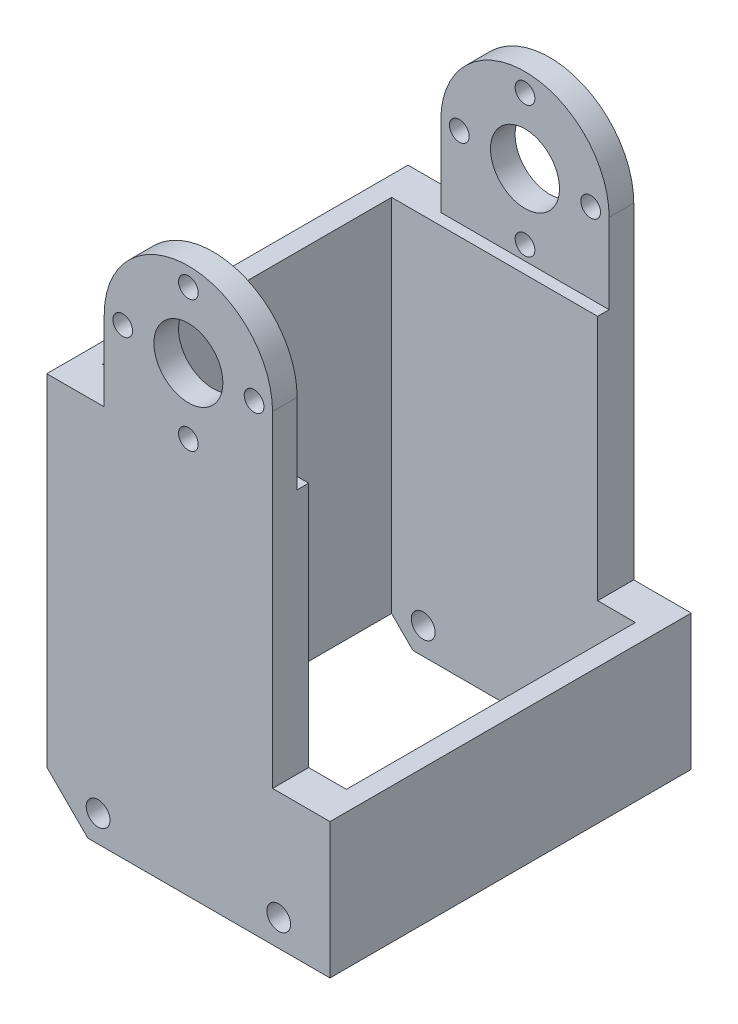
ISO-10303-21;
HEADER;
FILE_DESCRIPTION(('STEP AP214'),'2;1');
FILE_NAME('part.step','',(''),(''),'','','');
FILE_SCHEMA(('AUTOMOTIVE_DESIGN { 1 0 10303 214 1 1 1 1 }'));
ENDSEC;
DATA;
#1=APPLICATION_CONTEXT('core data for automotive mechanical design processes');
#2=APPLICATION_PROTOCOL_DEFINITION('international standard','automotive_design',2000,#1);
#3=PRODUCT_CONTEXT('',#1,'mechanical');
#4=PRODUCT('Part','Part','',(#3));
#5=PRODUCT_RELATED_PRODUCT_CATEGORY('part','',(#4));
#6=PRODUCT_DEFINITION_FORMATION('','',#4);
#7=PRODUCT_DEFINITION_CONTEXT('part definition',#1,'design');
#8=PRODUCT_DEFINITION('design','',#6,#7);
#9=PRODUCT_DEFINITION_SHAPE('','',#8);
#10=(LENGTH_UNIT() NAMED_UNIT(*) SI_UNIT(.MILLI.,.METRE.));
#11=(NAMED_UNIT(*) PLANE_ANGLE_UNIT() SI_UNIT($,.RADIAN.));
#12=(NAMED_UNIT(*) SI_UNIT($,.STERADIAN.) SOLID_ANGLE_UNIT());
#13=UNCERTAINTY_MEASURE_WITH_UNIT(LENGTH_MEASURE(1.E-05),#10,'distance_accuracy_value','');
#14=(GEOMETRIC_REPRESENTATION_CONTEXT(3) GLOBAL_UNCERTAINTY_ASSIGNED_CONTEXT((#13)) GLOBAL_UNIT_ASSIGNED_CONTEXT((#10,
#11,#12)) REPRESENTATION_CONTEXT('',''));
#15=CARTESIAN_POINT('',(0.,0.,0.));
#16=DIRECTION('',(0.,0.,1.));
#17=DIRECTION('',(1.,0.,0.));
#18=AXIS2_PLACEMENT_3D('',#15,#16,#17);
#19=CARTESIAN_POINT('',(0.,0.,-22.));
#20=DIRECTION('',(0.,0.,1.));
#21=DIRECTION('',(1.,0.,0.));
#22=AXIS2_PLACEMENT_3D('',#19,#20,#21);
#23=PLANE('',#22);
#24=CARTESIAN_POINT('',(-8.,0.,-22.));
#25=DIRECTION('',(0.,0.,1.));
#26=DIRECTION('',(1.,0.,0.));
#27=AXIS2_PLACEMENT_3D('',#24,#25,#26);
#28=CIRCLE('',#27,1.2);
#29=CARTESIAN_POINT('',(-6.8,0.,-22.));
#30=VERTEX_POINT('',#29);
#31=EDGE_CURVE('E406',#30,#30,#28,.T.);
#32=ORIENTED_EDGE('',*,*,#31,.T.);
#33=EDGE_LOOP('',(#32));
#34=FACE_BOUND('',#33,.T.);
#35=CARTESIAN_POINT('',(0.,8.,-22.));
#36=DIRECTION('',(0.,0.,1.));
#37=DIRECTION('',(1.,0.,0.));
#38=AXIS2_PLACEMENT_3D('',#35,#36,#37);
#39=CIRCLE('',#38,1.2);
#40=CARTESIAN_POINT('',(1.2,8.,-22.));
#41=VERTEX_POINT('',#40);
#42=EDGE_CURVE('E410',#41,#41,#39,.T.);
#43=ORIENTED_EDGE('',*,*,#42,.T.);
#44=EDGE_LOOP('',(#43));
#45=FACE_BOUND('',#44,.T.);
#46=CARTESIAN_POINT('',(8.,0.,-22.));
#47=DIRECTION('',(0.,0.,1.));
#48=DIRECTION('',(1.,0.,0.));
#49=AXIS2_PLACEMENT_3D('',#46,#47,#48);
#50=CIRCLE('',#49,1.2);
#51=CARTESIAN_POINT('',(9.2,0.,-22.));
#52=VERTEX_POINT('',#51);
#53=EDGE_CURVE('E414',#52,#52,#50,.T.);
#54=ORIENTED_EDGE('',*,*,#53,.T.);
#55=EDGE_LOOP('',(#54));
#56=FACE_BOUND('',#55,.T.);
#57=CARTESIAN_POINT('',(0.,0.,-22.));
#58=DIRECTION('',(0.,0.,1.));
#59=DIRECTION('',(1.,0.,0.));
#60=AXIS2_PLACEMENT_3D('',#57,#58,#59);
#61=CIRCLE('',#60,4.2);
#62=CARTESIAN_POINT('',(4.2,0.,-22.));
#63=VERTEX_POINT('',#62);
#64=EDGE_CURVE('E418',#63,#63,#61,.T.);
#65=ORIENTED_EDGE('',*,*,#64,.T.);
#66=EDGE_LOOP('',(#65));
#67=FACE_BOUND('',#66,.T.);
#68=CARTESIAN_POINT('',(0.,-8.,-22.));
#69=DIRECTION('',(0.,0.,1.));
#70=DIRECTION('',(1.,0.,0.));
#71=AXIS2_PLACEMENT_3D('',#68,#69,#70);
#72=CIRCLE('',#71,1.2);
#73=CARTESIAN_POINT('',(1.19999999999994,-8.,-22.));
#74=VERTEX_POINT('',#73);
#75=EDGE_CURVE('E433',#74,#74,#72,.T.);
#76=ORIENTED_EDGE('',*,*,#75,.T.);
#77=EDGE_LOOP('',(#76));
#78=FACE_BOUND('',#77,.T.);
#79=CARTESIAN_POINT('',(11.,-53.,-22.));
#80=DIRECTION('',(0.,0.,1.));
#81=DIRECTION('',(1.,0.,0.));
#82=AXIS2_PLACEMENT_3D('',#79,#80,#81);
#83=CIRCLE('',#82,1.45);
#84=CARTESIAN_POINT('',(12.45,-53.,-22.));
#85=VERTEX_POINT('',#84);
#86=EDGE_CURVE('E601',#85,#85,#83,.T.);
#87=ORIENTED_EDGE('',*,*,#86,.T.);
#88=EDGE_LOOP('',(#87));
#89=FACE_BOUND('',#88,.T.);
#90=CARTESIAN_POINT('',(-11.,-53.,-22.));
#91=DIRECTION('',(0.,0.,1.));
#92=DIRECTION('',(1.,0.,0.));
#93=AXIS2_PLACEMENT_3D('',#90,#91,#92);
#94=CIRCLE('',#93,1.45);
#95=CARTESIAN_POINT('',(-9.55,-53.,-22.));
#96=VERTEX_POINT('',#95);
#97=EDGE_CURVE('E592',#96,#96,#94,.T.);
#98=ORIENTED_EDGE('',*,*,#97,.T.);
#99=EDGE_LOOP('',(#98));
#100=FACE_BOUND('',#99,.T.);
#101=DIRECTION('',(1.,0.,0.));
#102=VECTOR('',#101,1.);
#103=CARTESIAN_POINT('',(0.,-56.25,-22.));
#104=LINE('',#103,#102);
#105=CARTESIAN_POINT('',(-12.25,-56.25,-22.));
#106=VERTEX_POINT('',#105);
#107=CARTESIAN_POINT('',(17.25,-56.25,-22.));
#108=VERTEX_POINT('',#107);
#109=EDGE_CURVE('E517',#106,#108,#104,.T.);
#110=ORIENTED_EDGE('',*,*,#109,.F.);
#111=DIRECTION('',(0.707106781186544,-0.707106781186551,0.));
#112=VECTOR('',#111,1.);
#113=CARTESIAN_POINT('',(-17.25,-51.2499999999999,-22.));
#114=LINE('',#113,#112);
#115=CARTESIAN_POINT('',(-17.25,-51.2499999999999,-22.));
#116=VERTEX_POINT('',#115);
#117=EDGE_CURVE('E12',#106,#116,#114,.F.);
#118=ORIENTED_EDGE('',*,*,#117,.T.);
#119=DIRECTION('',(0.,1.,0.));
#120=VECTOR('',#119,1.);
#121=CARTESIAN_POINT('',(-17.25,-75.25,-22.));
#122=LINE('',#121,#120);
#123=CARTESIAN_POINT('',(-17.25,-9.75,-22.));
#124=VERTEX_POINT('',#123);
#125=EDGE_CURVE('E306',#116,#124,#122,.T.);
#126=ORIENTED_EDGE('',*,*,#125,.T.);
#127=DIRECTION('',(-1.,0.,0.));
#128=VECTOR('',#127,1.);
#129=CARTESIAN_POINT('',(-10.25,-9.75,-22.));
#130=LINE('',#129,#128);
#131=CARTESIAN_POINT('',(-10.25,-9.75,-22.));
#132=VERTEX_POINT('',#131);
#133=EDGE_CURVE('E295',#132,#124,#130,.T.);
#134=ORIENTED_EDGE('',*,*,#133,.F.);
#135=DIRECTION('',(0.,-1.,0.));
#136=VECTOR('',#135,1.);
#137=CARTESIAN_POINT('',(-10.25,0.,-22.));
#138=LINE('',#137,#136);
#139=CARTESIAN_POINT('',(-10.25,0.,-22.));
#140=VERTEX_POINT('',#139);
#141=EDGE_CURVE('E426',#140,#132,#138,.T.);
#142=ORIENTED_EDGE('',*,*,#141,.F.);
#143=CARTESIAN_POINT('',(0.,0.,-22.));
#144=DIRECTION('',(0.,0.,1.));
#145=DIRECTION('',(1.,0.,0.));
#146=AXIS2_PLACEMENT_3D('',#143,#144,#145);
#147=CIRCLE('',#146,10.25);
#148=CARTESIAN_POINT('',(10.25,0.,-22.));
#149=VERTEX_POINT('',#148);
#150=EDGE_CURVE('E422',#149,#140,#147,.T.);
#151=ORIENTED_EDGE('',*,*,#150,.F.);
#152=DIRECTION('',(0.,-1.,0.));
#153=VECTOR('',#152,1.);
#154=CARTESIAN_POINT('',(10.25,0.,-22.));
#155=LINE('',#154,#153);
#156=CARTESIAN_POINT('',(10.25,-39.75,-22.));
#157=VERTEX_POINT('',#156);
#158=EDGE_CURVE('E430',#149,#157,#155,.T.);
#159=ORIENTED_EDGE('',*,*,#158,.T.);
#160=DIRECTION('',(-1.,0.,0.));
#161=VECTOR('',#160,1.);
#162=CARTESIAN_POINT('',(17.25,-39.75,-22.));
#163=LINE('',#162,#161);
#164=CARTESIAN_POINT('',(17.25,-39.75,-22.));
#165=VERTEX_POINT('',#164);
#166=EDGE_CURVE('E262',#165,#157,#163,.T.);
#167=ORIENTED_EDGE('',*,*,#166,.F.);
#168=DIRECTION('',(0.,1.,0.));
#169=VECTOR('',#168,1.);
#170=CARTESIAN_POINT('',(17.25,-75.25,-22.));
#171=LINE('',#170,#169);
#172=EDGE_CURVE('E271',#108,#165,#171,.T.);
#173=ORIENTED_EDGE('',*,*,#172,.F.);
#174=EDGE_LOOP('',(#110,#118,#126,#134,#142,#151,#159,#167,#173));
#175=FACE_BOUND('',#174,.T.);
#176=ADVANCED_FACE('F109',(#34,#45,#56,#67,#78,#89,#100,#175),#23,.F.);
#177=CARTESIAN_POINT('',(0.,0.,22.));
#178=DIRECTION('',(0.,0.,1.));
#179=DIRECTION('',(1.,0.,0.));
#180=AXIS2_PLACEMENT_3D('',#177,#178,#179);
#181=PLANE('',#180);
#182=DIRECTION('',(0.,1.,0.));
#183=VECTOR('',#182,1.);
#184=CARTESIAN_POINT('',(-17.25,-75.25,22.));
#185=LINE('',#184,#183);
#186=CARTESIAN_POINT('',(-17.25,-51.2499999999999,22.));
#187=VERTEX_POINT('',#186);
#188=CARTESIAN_POINT('',(-17.25,-9.75,22.));
#189=VERTEX_POINT('',#188);
#190=EDGE_CURVE('E307',#187,#189,#185,.T.);
#191=ORIENTED_EDGE('',*,*,#190,.F.);
#192=DIRECTION('',(-0.707106781186544,0.707106781186551,0.));
#193=VECTOR('',#192,1.);
#194=CARTESIAN_POINT('',(-34.25,-34.2499999999997,22.));
#195=LINE('',#194,#193);
#196=CARTESIAN_POINT('',(-12.25,-56.25,22.));
#197=VERTEX_POINT('',#196);
#198=EDGE_CURVE('E477',#187,#197,#195,.F.);
#199=ORIENTED_EDGE('',*,*,#198,.T.);
#200=DIRECTION('',(1.,0.,0.));
#201=VECTOR('',#200,1.);
#202=CARTESIAN_POINT('',(0.,-56.25,22.));
#203=LINE('',#202,#201);
#204=CARTESIAN_POINT('',(17.25,-56.25,22.));
#205=VERTEX_POINT('',#204);
#206=EDGE_CURVE('E279',#197,#205,#203,.T.);
#207=ORIENTED_EDGE('',*,*,#206,.T.);
#208=DIRECTION('',(0.,1.,0.));
#209=VECTOR('',#208,1.);
#210=CARTESIAN_POINT('',(17.25,-75.25,22.));
#211=LINE('',#210,#209);
#212=CARTESIAN_POINT('',(17.25,-39.75,22.));
#213=VERTEX_POINT('',#212);
#214=EDGE_CURVE('E269',#205,#213,#211,.T.);
#215=ORIENTED_EDGE('',*,*,#214,.T.);
#216=DIRECTION('',(-1.,0.,0.));
#217=VECTOR('',#216,1.);
#218=CARTESIAN_POINT('',(17.25,-39.75,22.));
#219=LINE('',#218,#217);
#220=CARTESIAN_POINT('',(10.25,-39.75,22.));
#221=VERTEX_POINT('',#220);
#222=EDGE_CURVE('E250',#213,#221,#219,.T.);
#223=ORIENTED_EDGE('',*,*,#222,.T.);
#224=DIRECTION('',(0.,-1.,0.));
#225=VECTOR('',#224,1.);
#226=CARTESIAN_POINT('',(10.25,0.,22.));
#227=LINE('',#226,#225);
#228=CARTESIAN_POINT('',(10.25,0.,22.));
#229=VERTEX_POINT('',#228);
#230=EDGE_CURVE('E399',#229,#221,#227,.T.);
#231=ORIENTED_EDGE('',*,*,#230,.F.);
#232=CARTESIAN_POINT('',(0.,0.,22.));
#233=DIRECTION('',(0.,0.,1.));
#234=DIRECTION('',(1.,0.,0.));
#235=AXIS2_PLACEMENT_3D('',#232,#233,#234);
#236=CIRCLE('',#235,10.25);
#237=CARTESIAN_POINT('',(-10.25,0.,22.));
#238=VERTEX_POINT('',#237);
#239=EDGE_CURVE('E391',#229,#238,#236,.T.);
#240=ORIENTED_EDGE('',*,*,#239,.T.);
#241=DIRECTION('',(0.,-1.,0.));
#242=VECTOR('',#241,1.);
#243=CARTESIAN_POINT('',(-10.25,0.,22.));
#244=LINE('',#243,#242);
#245=CARTESIAN_POINT('',(-10.25,-9.75,22.));
#246=VERTEX_POINT('',#245);
#247=EDGE_CURVE('E395',#238,#246,#244,.T.);
#248=ORIENTED_EDGE('',*,*,#247,.T.);
#249=DIRECTION('',(1.,0.,0.));
#250=VECTOR('',#249,1.);
#251=CARTESIAN_POINT('',(-10.25,-9.75,22.));
#252=LINE('',#251,#250);
#253=EDGE_CURVE('E303',#189,#246,#252,.T.);
#254=ORIENTED_EDGE('',*,*,#253,.F.);
#255=EDGE_LOOP('',(#191,#199,#207,#215,#223,#231,#240,#248,#254));
#256=FACE_BOUND('',#255,.T.);
#257=CARTESIAN_POINT('',(0.,-8.,22.));
#258=DIRECTION('',(0.,0.,1.));
#259=DIRECTION('',(1.,0.,0.));
#260=AXIS2_PLACEMENT_3D('',#257,#258,#259);
#261=CIRCLE('',#260,1.2);
#262=CARTESIAN_POINT('',(1.19999999999994,-8.,22.));
#263=VERTEX_POINT('',#262);
#264=EDGE_CURVE('E402',#263,#263,#261,.T.);
#265=ORIENTED_EDGE('',*,*,#264,.F.);
#266=EDGE_LOOP('',(#265));
#267=FACE_BOUND('',#266,.T.);
#268=CARTESIAN_POINT('',(0.,0.,22.));
#269=DIRECTION('',(0.,0.,1.));
#270=DIRECTION('',(1.,0.,0.));
#271=AXIS2_PLACEMENT_3D('',#268,#269,#270);
#272=CIRCLE('',#271,4.2);
#273=CARTESIAN_POINT('',(4.2,0.,22.));
#274=VERTEX_POINT('',#273);
#275=EDGE_CURVE('E387',#274,#274,#272,.T.);
#276=ORIENTED_EDGE('',*,*,#275,.F.);
#277=EDGE_LOOP('',(#276));
#278=FACE_BOUND('',#277,.T.);
#279=CARTESIAN_POINT('',(8.,0.,22.));
#280=DIRECTION('',(0.,0.,1.));
#281=DIRECTION('',(1.,0.,0.));
#282=AXIS2_PLACEMENT_3D('',#279,#280,#281);
#283=CIRCLE('',#282,1.2);
#284=CARTESIAN_POINT('',(9.2,0.,22.));
#285=VERTEX_POINT('',#284);
#286=EDGE_CURVE('E383',#285,#285,#283,.T.);
#287=ORIENTED_EDGE('',*,*,#286,.F.);
#288=EDGE_LOOP('',(#287));
#289=FACE_BOUND('',#288,.T.);
#290=CARTESIAN_POINT('',(0.,8.,22.));
#291=DIRECTION('',(0.,0.,1.));
#292=DIRECTION('',(1.,0.,0.));
#293=AXIS2_PLACEMENT_3D('',#290,#291,#292);
#294=CIRCLE('',#293,1.2);
#295=CARTESIAN_POINT('',(1.2,8.,22.));
#296=VERTEX_POINT('',#295);
#297=EDGE_CURVE('E379',#296,#296,#294,.T.);
#298=ORIENTED_EDGE('',*,*,#297,.F.);
#299=EDGE_LOOP('',(#298));
#300=FACE_BOUND('',#299,.T.);
#301=CARTESIAN_POINT('',(-8.,0.,22.));
#302=DIRECTION('',(0.,0.,1.));
#303=DIRECTION('',(1.,0.,0.));
#304=AXIS2_PLACEMENT_3D('',#301,#302,#303);
#305=CIRCLE('',#304,1.2);
#306=CARTESIAN_POINT('',(-6.8,0.,22.));
#307=VERTEX_POINT('',#306);
#308=EDGE_CURVE('E375',#307,#307,#305,.T.);
#309=ORIENTED_EDGE('',*,*,#308,.F.);
#310=EDGE_LOOP('',(#309));
#311=FACE_BOUND('',#310,.T.);
#312=CARTESIAN_POINT('',(11.,-53.,22.));
#313=DIRECTION('',(0.,0.,1.));
#314=DIRECTION('',(1.,0.,0.));
#315=AXIS2_PLACEMENT_3D('',#312,#313,#314);
#316=CIRCLE('',#315,1.45);
#317=CARTESIAN_POINT('',(12.45,-53.,22.));
#318=VERTEX_POINT('',#317);
#319=EDGE_CURVE('E291',#318,#318,#316,.T.);
#320=ORIENTED_EDGE('',*,*,#319,.F.);
#321=EDGE_LOOP('',(#320));
#322=FACE_BOUND('',#321,.T.);
#323=CARTESIAN_POINT('',(-11.,-53.,22.));
#324=DIRECTION('',(0.,0.,1.));
#325=DIRECTION('',(1.,0.,0.));
#326=AXIS2_PLACEMENT_3D('',#323,#324,#325);
#327=CIRCLE('',#326,1.45);
#328=CARTESIAN_POINT('',(-9.55,-53.,22.));
#329=VERTEX_POINT('',#328);
#330=EDGE_CURVE('E598',#329,#329,#327,.T.);
#331=ORIENTED_EDGE('',*,*,#330,.F.);
#332=EDGE_LOOP('',(#331));
#333=FACE_BOUND('',#332,.T.);
#334=ADVANCED_FACE('F276',(#256,#267,#278,#289,#300,#311,#322,#333),#181,.T.);
#335=CARTESIAN_POINT('',(-17.25,-75.25,-22.));
#336=DIRECTION('',(-1.,0.,0.));
#337=DIRECTION('',(0.,0.,1.));
#338=AXIS2_PLACEMENT_3D('',#335,#336,#337);
#339=PLANE('',#338);
#340=ORIENTED_EDGE('',*,*,#125,.F.);
#341=DIRECTION('',(0.,0.,1.));
#342=VECTOR('',#341,1.);
#343=CARTESIAN_POINT('',(-17.25,-51.2499999999999,-22.));
#344=LINE('',#343,#342);
#345=EDGE_CURVE('E473',#116,#187,#344,.T.);
#346=ORIENTED_EDGE('',*,*,#345,.T.);
#347=ORIENTED_EDGE('',*,*,#190,.T.);
#348=DIRECTION('',(0.,0.,1.));
#349=VECTOR('',#348,1.);
#350=CARTESIAN_POINT('',(-17.25,-9.75,-22.));
#351=LINE('',#350,#349);
#352=EDGE_CURVE('E299',#124,#189,#351,.T.);
#353=ORIENTED_EDGE('',*,*,#352,.F.);
#354=EDGE_LOOP('',(#340,#346,#347,#353));
#355=FACE_BOUND('',#354,.T.);
#356=ADVANCED_FACE('F519',(#355),#339,.T.);
#357=CARTESIAN_POINT('',(17.25,-75.25,-22.));
#358=DIRECTION('',(1.,0.,0.));
#359=DIRECTION('',(0.,0.,-1.));
#360=AXIS2_PLACEMENT_3D('',#357,#358,#359);
#361=PLANE('',#360);
#362=DIRECTION('',(0.,0.,-1.));
#363=VECTOR('',#362,1.);
#364=CARTESIAN_POINT('',(17.25,-39.75,22.));
#365=LINE('',#364,#363);
#366=EDGE_CURVE('E254',#213,#165,#365,.T.);
#367=ORIENTED_EDGE('',*,*,#366,.F.);
#368=ORIENTED_EDGE('',*,*,#214,.F.);
#369=DIRECTION('',(0.,0.,1.));
#370=VECTOR('',#369,1.);
#371=CARTESIAN_POINT('',(17.25,-56.25,-22.));
#372=LINE('',#371,#370);
#373=EDGE_CURVE('E288',#108,#205,#372,.T.);
#374=ORIENTED_EDGE('',*,*,#373,.F.);
#375=ORIENTED_EDGE('',*,*,#172,.T.);
#376=EDGE_LOOP('',(#367,#368,#374,#375));
#377=FACE_BOUND('',#376,.T.);
#378=ADVANCED_FACE('F267',(#377),#361,.T.);
#379=CARTESIAN_POINT('',(10.25,0.,-22.));
#380=DIRECTION('',(-1.,0.,0.));
#381=DIRECTION('',(0.,0.,1.));
#382=AXIS2_PLACEMENT_3D('',#379,#380,#381);
#383=PLANE('',#382);
#384=ORIENTED_EDGE('',*,*,#230,.T.);
#385=DIRECTION('',(0.,0.,-1.));
#386=VECTOR('',#385,1.);
#387=CARTESIAN_POINT('',(10.25,-39.75,22.));
#388=LINE('',#387,#386);
#389=CARTESIAN_POINT('',(10.25,-39.75,17.6));
#390=VERTEX_POINT('',#389);
#391=EDGE_CURVE('E257',#221,#390,#388,.T.);
#392=ORIENTED_EDGE('',*,*,#391,.T.);
#393=DIRECTION('',(0.,-1.,0.));
#394=VECTOR('',#393,1.);
#395=CARTESIAN_POINT('',(10.25,10.25,17.6));
#396=LINE('',#395,#394);
#397=CARTESIAN_POINT('',(10.25,-9.75,17.6));
#398=VERTEX_POINT('',#397);
#399=EDGE_CURVE('E555',#398,#390,#396,.T.);
#400=ORIENTED_EDGE('',*,*,#399,.F.);
#401=DIRECTION('',(0.,0.,-1.));
#402=VECTOR('',#401,1.);
#403=CARTESIAN_POINT('',(10.25,-9.75,22.));
#404=LINE('',#403,#402);
#405=CARTESIAN_POINT('',(10.25,-9.75,19.));
#406=VERTEX_POINT('',#405);
#407=EDGE_CURVE('E544',#406,#398,#404,.T.);
#408=ORIENTED_EDGE('',*,*,#407,.F.);
#409=DIRECTION('',(0.,1.,0.));
#410=VECTOR('',#409,1.);
#411=CARTESIAN_POINT('',(10.25,10.25,19.));
#412=LINE('',#411,#410);
#413=CARTESIAN_POINT('',(10.25,0.,19.));
#414=VERTEX_POINT('',#413);
#415=EDGE_CURVE('E317',#406,#414,#412,.T.);
#416=ORIENTED_EDGE('',*,*,#415,.T.);
#417=DIRECTION('',(0.,0.,1.));
#418=VECTOR('',#417,1.);
#419=CARTESIAN_POINT('',(10.25,0.,-22.));
#420=LINE('',#419,#418);
#421=EDGE_CURVE('E443',#414,#229,#420,.T.);
#422=ORIENTED_EDGE('',*,*,#421,.T.);
#423=EDGE_LOOP('',(#384,#392,#400,#408,#416,#422));
#424=FACE_BOUND('',#423,.T.);
#425=ADVANCED_FACE('F654',(#424),#383,.F.);
#426=CARTESIAN_POINT('',(-10.25,0.,-22.));
#427=DIRECTION('',(-1.,0.,0.));
#428=DIRECTION('',(0.,0.,1.));
#429=AXIS2_PLACEMENT_3D('',#426,#427,#428);
#430=PLANE('',#429);
#431=ORIENTED_EDGE('',*,*,#141,.T.);
#432=DIRECTION('',(0.,0.,-1.));
#433=VECTOR('',#432,1.);
#434=CARTESIAN_POINT('',(-10.25,-9.75,-22.));
#435=LINE('',#434,#433);
#436=CARTESIAN_POINT('',(-10.25,-9.75,-19.));
#437=VERTEX_POINT('',#436);
#438=EDGE_CURVE('E282',#437,#132,#435,.T.);
#439=ORIENTED_EDGE('',*,*,#438,.F.);
#440=DIRECTION('',(0.,-1.,0.));
#441=VECTOR('',#440,1.);
#442=CARTESIAN_POINT('',(-10.25,10.25,-19.));
#443=LINE('',#442,#441);
#444=CARTESIAN_POINT('',(-10.25,0.,-19.));
#445=VERTEX_POINT('',#444);
#446=EDGE_CURVE('E310',#445,#437,#443,.T.);
#447=ORIENTED_EDGE('',*,*,#446,.F.);
#448=DIRECTION('',(0.,0.,1.));
#449=VECTOR('',#448,1.);
#450=CARTESIAN_POINT('',(-10.25,0.,-22.));
#451=LINE('',#450,#449);
#452=EDGE_CURVE('E444',#140,#445,#451,.T.);
#453=ORIENTED_EDGE('',*,*,#452,.F.);
#454=EDGE_LOOP('',(#431,#439,#447,#453));
#455=FACE_BOUND('',#454,.T.);
#456=ADVANCED_FACE('F527',(#455),#430,.T.);
#457=DIRECTION('',(0.,1.,0.));
#458=VECTOR('',#457,1.);
#459=CARTESIAN_POINT('',(-10.25,10.25,19.));
#460=LINE('',#459,#458);
#461=CARTESIAN_POINT('',(-10.25,-9.75,19.));
#462=VERTEX_POINT('',#461);
#463=CARTESIAN_POINT('',(-10.25,0.,19.));
#464=VERTEX_POINT('',#463);
#465=EDGE_CURVE('E318',#462,#464,#460,.T.);
#466=ORIENTED_EDGE('',*,*,#465,.F.);
#467=EDGE_CURVE('E286',#246,#462,#435,.T.);
#468=ORIENTED_EDGE('',*,*,#467,.F.);
#469=ORIENTED_EDGE('',*,*,#247,.F.);
#470=EDGE_CURVE('E437',#464,#238,#451,.T.);
#471=ORIENTED_EDGE('',*,*,#470,.F.);
#472=EDGE_LOOP('',(#466,#468,#469,#471));
#473=FACE_BOUND('',#472,.T.);
#474=ADVANCED_FACE('F657',(#473),#430,.T.);
#475=CARTESIAN_POINT('',(0.,0.,-22.));
#476=DIRECTION('',(0.,0.,1.));
#477=DIRECTION('',(1.,0.,0.));
#478=AXIS2_PLACEMENT_3D('',#475,#476,#477);
#479=CYLINDRICAL_SURFACE('',#478,10.25);
#480=CARTESIAN_POINT('',(0.,0.,-19.));
#481=DIRECTION('',(0.,0.,-1.));
#482=DIRECTION('',(-1.,0.,0.));
#483=AXIS2_PLACEMENT_3D('',#480,#481,#482);
#484=CIRCLE('',#483,10.25);
#485=CARTESIAN_POINT('',(10.25,0.,-19.));
#486=VERTEX_POINT('',#485);
#487=EDGE_CURVE('E372',#486,#445,#484,.F.);
#488=ORIENTED_EDGE('',*,*,#487,.F.);
#489=EDGE_CURVE('E438',#149,#486,#420,.T.);
#490=ORIENTED_EDGE('',*,*,#489,.F.);
#491=ORIENTED_EDGE('',*,*,#150,.T.);
#492=ORIENTED_EDGE('',*,*,#452,.T.);
#493=EDGE_LOOP('',(#488,#490,#491,#492));
#494=FACE_BOUND('',#493,.T.);
#495=ADVANCED_FACE('F531',(#494),#479,.T.);
#496=CARTESIAN_POINT('',(0.,0.,-22.));
#497=DIRECTION('',(0.,0.,1.));
#498=DIRECTION('',(1.,0.,0.));
#499=AXIS2_PLACEMENT_3D('',#496,#497,#498);
#500=CYLINDRICAL_SURFACE('',#499,4.2);
#501=CARTESIAN_POINT('',(0.,0.,-19.));
#502=DIRECTION('',(0.,0.,-1.));
#503=DIRECTION('',(-1.,0.,0.));
#504=AXIS2_PLACEMENT_3D('',#501,#502,#503);
#505=CIRCLE('',#504,4.2);
#506=CARTESIAN_POINT('',(-4.2,0.,-19.));
#507=VERTEX_POINT('',#506);
#508=EDGE_CURVE('E368',#507,#507,#505,.F.);
#509=ORIENTED_EDGE('',*,*,#508,.T.);
#510=EDGE_LOOP('',(#509));
#511=FACE_BOUND('',#510,.T.);
#512=ORIENTED_EDGE('',*,*,#64,.F.);
#513=EDGE_LOOP('',(#512));
#514=FACE_BOUND('',#513,.T.);
#515=ADVANCED_FACE('F665',(#511,#514),#500,.F.);
#516=CARTESIAN_POINT('',(8.,0.,-22.));
#517=DIRECTION('',(0.,0.,1.));
#518=DIRECTION('',(1.,0.,0.));
#519=AXIS2_PLACEMENT_3D('',#516,#517,#518);
#520=CYLINDRICAL_SURFACE('',#519,1.2);
#521=CARTESIAN_POINT('',(8.,0.,-19.));
#522=DIRECTION('',(0.,0.,-1.));
#523=DIRECTION('',(-1.,0.,0.));
#524=AXIS2_PLACEMENT_3D('',#521,#522,#523);
#525=CIRCLE('',#524,1.2);
#526=CARTESIAN_POINT('',(6.8,0.,-19.));
#527=VERTEX_POINT('',#526);
#528=EDGE_CURVE('E364',#527,#527,#525,.F.);
#529=ORIENTED_EDGE('',*,*,#528,.T.);
#530=EDGE_LOOP('',(#529));
#531=FACE_BOUND('',#530,.T.);
#532=ORIENTED_EDGE('',*,*,#53,.F.);
#533=EDGE_LOOP('',(#532));
#534=FACE_BOUND('',#533,.T.);
#535=ADVANCED_FACE('F670',(#531,#534),#520,.F.);
#536=CARTESIAN_POINT('',(0.,8.,-22.));
#537=DIRECTION('',(0.,0.,1.));
#538=DIRECTION('',(1.,0.,0.));
#539=AXIS2_PLACEMENT_3D('',#536,#537,#538);
#540=CYLINDRICAL_SURFACE('',#539,1.2);
#541=CARTESIAN_POINT('',(0.,8.,-19.));
#542=DIRECTION('',(0.,0.,-1.));
#543=DIRECTION('',(-1.,0.,0.));
#544=AXIS2_PLACEMENT_3D('',#541,#542,#543);
#545=CIRCLE('',#544,1.2);
#546=CARTESIAN_POINT('',(-1.2,8.,-19.));
#547=VERTEX_POINT('',#546);
#548=EDGE_CURVE('E360',#547,#547,#545,.F.);
#549=ORIENTED_EDGE('',*,*,#548,.T.);
#550=EDGE_LOOP('',(#549));
#551=FACE_BOUND('',#550,.T.);
#552=ORIENTED_EDGE('',*,*,#42,.F.);
#553=EDGE_LOOP('',(#552));
#554=FACE_BOUND('',#553,.T.);
#555=ADVANCED_FACE('F673',(#551,#554),#540,.F.);
#556=CARTESIAN_POINT('',(-8.,0.,-22.));
#557=DIRECTION('',(0.,0.,1.));
#558=DIRECTION('',(1.,0.,0.));
#559=AXIS2_PLACEMENT_3D('',#556,#557,#558);
#560=CYLINDRICAL_SURFACE('',#559,1.2);
#561=CARTESIAN_POINT('',(-8.,0.,-19.));
#562=DIRECTION('',(0.,0.,-1.));
#563=DIRECTION('',(-1.,0.,0.));
#564=AXIS2_PLACEMENT_3D('',#561,#562,#563);
#565=CIRCLE('',#564,1.2);
#566=CARTESIAN_POINT('',(-9.2,0.,-19.));
#567=VERTEX_POINT('',#566);
#568=EDGE_CURVE('E356',#567,#567,#565,.F.);
#569=ORIENTED_EDGE('',*,*,#568,.T.);
#570=EDGE_LOOP('',(#569));
#571=FACE_BOUND('',#570,.T.);
#572=ORIENTED_EDGE('',*,*,#31,.F.);
#573=EDGE_LOOP('',(#572));
#574=FACE_BOUND('',#573,.T.);
#575=ADVANCED_FACE('F676',(#571,#574),#560,.F.);
#576=CARTESIAN_POINT('',(0.,-8.,-22.));
#577=DIRECTION('',(0.,0.,1.));
#578=DIRECTION('',(1.,0.,0.));
#579=AXIS2_PLACEMENT_3D('',#576,#577,#578);
#580=CYLINDRICAL_SURFACE('',#579,1.2);
#581=CARTESIAN_POINT('',(0.,-8.,-19.));
#582=DIRECTION('',(0.,0.,-1.));
#583=DIRECTION('',(-1.,0.,0.));
#584=AXIS2_PLACEMENT_3D('',#581,#582,#583);
#585=CIRCLE('',#584,1.2);
#586=CARTESIAN_POINT('',(-1.20000000000006,-8.,-19.));
#587=VERTEX_POINT('',#586);
#588=EDGE_CURVE('E355',#587,#587,#585,.F.);
#589=ORIENTED_EDGE('',*,*,#588,.T.);
#590=EDGE_LOOP('',(#589));
#591=FACE_BOUND('',#590,.T.);
#592=ORIENTED_EDGE('',*,*,#75,.F.);
#593=EDGE_LOOP('',(#592));
#594=FACE_BOUND('',#593,.T.);
#595=ADVANCED_FACE('F649',(#591,#594),#580,.F.);
#596=CARTESIAN_POINT('',(0.,0.,19.));
#597=DIRECTION('',(0.,0.,1.));
#598=DIRECTION('',(0.,-1.,0.));
#599=AXIS2_PLACEMENT_3D('',#596,#597,#598);
#600=CIRCLE('',#599,10.25);
#601=EDGE_CURVE('E352',#464,#414,#600,.F.);
#602=ORIENTED_EDGE('',*,*,#601,.F.);
#603=ORIENTED_EDGE('',*,*,#470,.T.);
#604=ORIENTED_EDGE('',*,*,#239,.F.);
#605=ORIENTED_EDGE('',*,*,#421,.F.);
#606=EDGE_LOOP('',(#602,#603,#604,#605));
#607=FACE_BOUND('',#606,.T.);
#608=ADVANCED_FACE('F653',(#607),#479,.T.);
#609=DIRECTION('',(0.,-1.,0.));
#610=VECTOR('',#609,1.);
#611=CARTESIAN_POINT('',(10.25,10.25,-19.));
#612=LINE('',#611,#610);
#613=CARTESIAN_POINT('',(10.25,-9.75,-19.));
#614=VERTEX_POINT('',#613);
#615=EDGE_CURVE('E313',#486,#614,#612,.T.);
#616=ORIENTED_EDGE('',*,*,#615,.T.);
#617=CARTESIAN_POINT('',(10.25,-9.75,-17.6));
#618=VERTEX_POINT('',#617);
#619=EDGE_CURVE('E542',#618,#614,#404,.T.);
#620=ORIENTED_EDGE('',*,*,#619,.F.);
#621=DIRECTION('',(0.,1.,0.));
#622=VECTOR('',#621,1.);
#623=CARTESIAN_POINT('',(10.25,10.25,-17.6));
#624=LINE('',#623,#622);
#625=CARTESIAN_POINT('',(10.25,-39.75,-17.6));
#626=VERTEX_POINT('',#625);
#627=EDGE_CURVE('E469',#626,#618,#624,.T.);
#628=ORIENTED_EDGE('',*,*,#627,.F.);
#629=EDGE_CURVE('E273',#626,#157,#388,.T.);
#630=ORIENTED_EDGE('',*,*,#629,.T.);
#631=ORIENTED_EDGE('',*,*,#158,.F.);
#632=ORIENTED_EDGE('',*,*,#489,.T.);
#633=EDGE_LOOP('',(#616,#620,#628,#630,#631,#632));
#634=FACE_BOUND('',#633,.T.);
#635=ADVANCED_FACE('F536',(#634),#383,.F.);
#636=CARTESIAN_POINT('',(0.,0.,19.));
#637=DIRECTION('',(0.,0.,1.));
#638=DIRECTION('',(0.,-1.,0.));
#639=AXIS2_PLACEMENT_3D('',#636,#637,#638);
#640=CIRCLE('',#639,4.2);
#641=CARTESIAN_POINT('',(0.,-4.2,19.));
#642=VERTEX_POINT('',#641);
#643=EDGE_CURVE('E348',#642,#642,#640,.F.);
#644=ORIENTED_EDGE('',*,*,#643,.T.);
#645=EDGE_LOOP('',(#644));
#646=FACE_BOUND('',#645,.T.);
#647=ORIENTED_EDGE('',*,*,#275,.T.);
#648=EDGE_LOOP('',(#647));
#649=FACE_BOUND('',#648,.T.);
#650=ADVANCED_FACE('F652',(#646,#649),#500,.F.);
#651=CARTESIAN_POINT('',(8.,0.,19.));
#652=DIRECTION('',(0.,0.,1.));
#653=DIRECTION('',(0.,-1.,0.));
#654=AXIS2_PLACEMENT_3D('',#651,#652,#653);
#655=CIRCLE('',#654,1.2);
#656=CARTESIAN_POINT('',(8.,-1.20000000000003,19.));
#657=VERTEX_POINT('',#656);
#658=EDGE_CURVE('E344',#657,#657,#655,.F.);
#659=ORIENTED_EDGE('',*,*,#658,.T.);
#660=EDGE_LOOP('',(#659));
#661=FACE_BOUND('',#660,.T.);
#662=ORIENTED_EDGE('',*,*,#286,.T.);
#663=EDGE_LOOP('',(#662));
#664=FACE_BOUND('',#663,.T.);
#665=ADVANCED_FACE('F663',(#661,#664),#520,.F.);
#666=CARTESIAN_POINT('',(0.,8.,19.));
#667=DIRECTION('',(0.,0.,1.));
#668=DIRECTION('',(0.,-1.,0.));
#669=AXIS2_PLACEMENT_3D('',#666,#667,#668);
#670=CIRCLE('',#669,1.2);
#671=CARTESIAN_POINT('',(0.,6.8,19.));
#672=VERTEX_POINT('',#671);
#673=EDGE_CURVE('E340',#672,#672,#670,.F.);
#674=ORIENTED_EDGE('',*,*,#673,.T.);
#675=EDGE_LOOP('',(#674));
#676=FACE_BOUND('',#675,.T.);
#677=ORIENTED_EDGE('',*,*,#297,.T.);
#678=EDGE_LOOP('',(#677));
#679=FACE_BOUND('',#678,.T.);
#680=ADVANCED_FACE('F668',(#676,#679),#540,.F.);
#681=CARTESIAN_POINT('',(-8.,0.,19.));
#682=DIRECTION('',(0.,0.,1.));
#683=DIRECTION('',(0.,-1.,0.));
#684=AXIS2_PLACEMENT_3D('',#681,#682,#683);
#685=CIRCLE('',#684,1.2);
#686=CARTESIAN_POINT('',(-8.,-1.19999999999992,19.));
#687=VERTEX_POINT('',#686);
#688=EDGE_CURVE('E336',#687,#687,#685,.F.);
#689=ORIENTED_EDGE('',*,*,#688,.T.);
#690=EDGE_LOOP('',(#689));
#691=FACE_BOUND('',#690,.T.);
#692=ORIENTED_EDGE('',*,*,#308,.T.);
#693=EDGE_LOOP('',(#692));
#694=FACE_BOUND('',#693,.T.);
#695=ADVANCED_FACE('F647',(#691,#694),#560,.F.);
#696=CARTESIAN_POINT('',(0.,-8.,19.));
#697=DIRECTION('',(0.,0.,1.));
#698=DIRECTION('',(0.,-1.,0.));
#699=AXIS2_PLACEMENT_3D('',#696,#697,#698);
#700=CIRCLE('',#699,1.2);
#701=CARTESIAN_POINT('',(0.,-9.2,19.));
#702=VERTEX_POINT('',#701);
#703=EDGE_CURVE('E332',#702,#702,#700,.F.);
#704=ORIENTED_EDGE('',*,*,#703,.T.);
#705=EDGE_LOOP('',(#704));
#706=FACE_BOUND('',#705,.T.);
#707=ORIENTED_EDGE('',*,*,#264,.T.);
#708=EDGE_LOOP('',(#707));
#709=FACE_BOUND('',#708,.T.);
#710=ADVANCED_FACE('F643',(#706,#709),#580,.F.);
#711=CARTESIAN_POINT('',(10.25,10.25,-19.));
#712=DIRECTION('',(0.,0.,-1.));
#713=DIRECTION('',(-1.,0.,0.));
#714=AXIS2_PLACEMENT_3D('',#711,#712,#713);
#715=PLANE('',#714);
#716=ORIENTED_EDGE('',*,*,#487,.T.);
#717=ORIENTED_EDGE('',*,*,#446,.T.);
#718=DIRECTION('',(-1.,0.,0.));
#719=VECTOR('',#718,1.);
#720=CARTESIAN_POINT('',(10.25,-9.75,-19.));
#721=LINE('',#720,#719);
#722=EDGE_CURVE('E322',#614,#437,#721,.T.);
#723=ORIENTED_EDGE('',*,*,#722,.F.);
#724=ORIENTED_EDGE('',*,*,#615,.F.);
#725=EDGE_LOOP('',(#716,#717,#723,#724));
#726=FACE_BOUND('',#725,.T.);
#727=ORIENTED_EDGE('',*,*,#528,.F.);
#728=EDGE_LOOP('',(#727));
#729=FACE_BOUND('',#728,.T.);
#730=ORIENTED_EDGE('',*,*,#568,.F.);
#731=EDGE_LOOP('',(#730));
#732=FACE_BOUND('',#731,.T.);
#733=ORIENTED_EDGE('',*,*,#588,.F.);
#734=EDGE_LOOP('',(#733));
#735=FACE_BOUND('',#734,.T.);
#736=ORIENTED_EDGE('',*,*,#548,.F.);
#737=EDGE_LOOP('',(#736));
#738=FACE_BOUND('',#737,.T.);
#739=ORIENTED_EDGE('',*,*,#508,.F.);
#740=EDGE_LOOP('',(#739));
#741=FACE_BOUND('',#740,.T.);
#742=ADVANCED_FACE('F646',(#726,#729,#732,#735,#738,#741),#715,.F.);
#743=CARTESIAN_POINT('',(10.25,10.25,19.));
#744=DIRECTION('',(0.,0.,1.));
#745=DIRECTION('',(0.,-1.,0.));
#746=AXIS2_PLACEMENT_3D('',#743,#744,#745);
#747=PLANE('',#746);
#748=ORIENTED_EDGE('',*,*,#601,.T.);
#749=ORIENTED_EDGE('',*,*,#415,.F.);
#750=DIRECTION('',(-1.,0.,0.));
#751=VECTOR('',#750,1.);
#752=CARTESIAN_POINT('',(10.25,-9.75,19.));
#753=LINE('',#752,#751);
#754=EDGE_CURVE('E328',#406,#462,#753,.T.);
#755=ORIENTED_EDGE('',*,*,#754,.T.);
#756=ORIENTED_EDGE('',*,*,#465,.T.);
#757=EDGE_LOOP('',(#748,#749,#755,#756));
#758=FACE_BOUND('',#757,.T.);
#759=ORIENTED_EDGE('',*,*,#658,.F.);
#760=EDGE_LOOP('',(#759));
#761=FACE_BOUND('',#760,.T.);
#762=ORIENTED_EDGE('',*,*,#688,.F.);
#763=EDGE_LOOP('',(#762));
#764=FACE_BOUND('',#763,.T.);
#765=ORIENTED_EDGE('',*,*,#703,.F.);
#766=EDGE_LOOP('',(#765));
#767=FACE_BOUND('',#766,.T.);
#768=ORIENTED_EDGE('',*,*,#673,.F.);
#769=EDGE_LOOP('',(#768));
#770=FACE_BOUND('',#769,.T.);
#771=ORIENTED_EDGE('',*,*,#643,.F.);
#772=EDGE_LOOP('',(#771));
#773=FACE_BOUND('',#772,.T.);
#774=ADVANCED_FACE('F694',(#758,#761,#764,#767,#770,#773),#747,.F.);
#775=CARTESIAN_POINT('',(10.25,-9.75,-19.));
#776=DIRECTION('',(0.,-1.,0.));
#777=DIRECTION('',(0.,0.,-1.));
#778=AXIS2_PLACEMENT_3D('',#775,#776,#777);
#779=PLANE('',#778);
#780=ORIENTED_EDGE('',*,*,#754,.F.);
#781=ORIENTED_EDGE('',*,*,#407,.T.);
#782=DIRECTION('',(-1.,0.,0.));
#783=VECTOR('',#782,1.);
#784=CARTESIAN_POINT('',(10.25,-9.75,17.6));
#785=LINE('',#784,#783);
#786=CARTESIAN_POINT('',(-14.85,-9.75,17.6));
#787=VERTEX_POINT('',#786);
#788=EDGE_CURVE('E581',#398,#787,#785,.T.);
#789=ORIENTED_EDGE('',*,*,#788,.T.);
#790=DIRECTION('',(0.,0.,-1.));
#791=VECTOR('',#790,1.);
#792=CARTESIAN_POINT('',(-14.85,-9.75,-19.));
#793=LINE('',#792,#791);
#794=CARTESIAN_POINT('',(-14.85,-9.75,-17.6));
#795=VERTEX_POINT('',#794);
#796=EDGE_CURVE('E584',#787,#795,#793,.T.);
#797=ORIENTED_EDGE('',*,*,#796,.T.);
#798=DIRECTION('',(1.,0.,0.));
#799=VECTOR('',#798,1.);
#800=CARTESIAN_POINT('',(10.25,-9.75,-17.6));
#801=LINE('',#800,#799);
#802=EDGE_CURVE('E465',#795,#618,#801,.T.);
#803=ORIENTED_EDGE('',*,*,#802,.T.);
#804=ORIENTED_EDGE('',*,*,#619,.T.);
#805=ORIENTED_EDGE('',*,*,#722,.T.);
#806=ORIENTED_EDGE('',*,*,#438,.T.);
#807=ORIENTED_EDGE('',*,*,#133,.T.);
#808=ORIENTED_EDGE('',*,*,#352,.T.);
#809=ORIENTED_EDGE('',*,*,#253,.T.);
#810=ORIENTED_EDGE('',*,*,#467,.T.);
#811=EDGE_LOOP('',(#780,#781,#789,#797,#803,#804,#805,#806,#807,#808,#809,#810));
#812=FACE_BOUND('',#811,.T.);
#813=ADVANCED_FACE('F523',(#812),#779,.F.);
#814=CARTESIAN_POINT('',(0.,-56.25,-22.));
#815=DIRECTION('',(0.,-1.,0.));
#816=DIRECTION('',(0.,0.,-1.));
#817=AXIS2_PLACEMENT_3D('',#814,#815,#816);
#818=PLANE('',#817);
#819=ORIENTED_EDGE('',*,*,#206,.F.);
#820=DIRECTION('',(0.,0.,-1.));
#821=VECTOR('',#820,1.);
#822=CARTESIAN_POINT('',(-12.25,-56.25,-22.));
#823=LINE('',#822,#821);
#824=CARTESIAN_POINT('',(-12.25,-56.25,17.6));
#825=VERTEX_POINT('',#824);
#826=EDGE_CURVE('E483',#197,#825,#823,.T.);
#827=ORIENTED_EDGE('',*,*,#826,.T.);
#828=DIRECTION('',(-1.,0.,0.));
#829=VECTOR('',#828,1.);
#830=CARTESIAN_POINT('',(-14.85,-56.25,17.6));
#831=LINE('',#830,#829);
#832=CARTESIAN_POINT('',(14.85,-56.25,17.6));
#833=VERTEX_POINT('',#832);
#834=EDGE_CURVE('E509',#833,#825,#831,.T.);
#835=ORIENTED_EDGE('',*,*,#834,.F.);
#836=DIRECTION('',(0.,0.,1.));
#837=VECTOR('',#836,1.);
#838=CARTESIAN_POINT('',(14.85,-56.25,-17.6));
#839=LINE('',#838,#837);
#840=CARTESIAN_POINT('',(14.85,-56.25,-17.6));
#841=VERTEX_POINT('',#840);
#842=EDGE_CURVE('E506',#841,#833,#839,.T.);
#843=ORIENTED_EDGE('',*,*,#842,.F.);
#844=DIRECTION('',(1.,0.,0.));
#845=VECTOR('',#844,1.);
#846=CARTESIAN_POINT('',(-14.85,-56.25,-17.6));
#847=LINE('',#846,#845);
#848=CARTESIAN_POINT('',(-12.25,-56.25,-17.6));
#849=VERTEX_POINT('',#848);
#850=EDGE_CURVE('E495',#849,#841,#847,.T.);
#851=ORIENTED_EDGE('',*,*,#850,.F.);
#852=DIRECTION('',(0.,0.,-1.));
#853=VECTOR('',#852,1.);
#854=CARTESIAN_POINT('',(-12.25,-56.25,-22.));
#855=LINE('',#854,#853);
#856=EDGE_CURVE('E480',#849,#106,#855,.T.);
#857=ORIENTED_EDGE('',*,*,#856,.T.);
#858=ORIENTED_EDGE('',*,*,#109,.T.);
#859=ORIENTED_EDGE('',*,*,#373,.T.);
#860=EDGE_LOOP('',(#819,#827,#835,#843,#851,#857,#858,#859));
#861=FACE_BOUND('',#860,.T.);
#862=ADVANCED_FACE('F502',(#861),#818,.T.);
#863=CARTESIAN_POINT('',(11.,-53.,-22.));
#864=DIRECTION('',(0.,0.,1.));
#865=DIRECTION('',(1.,0.,0.));
#866=AXIS2_PLACEMENT_3D('',#863,#864,#865);
#867=CYLINDRICAL_SURFACE('',#866,1.45);
#868=CARTESIAN_POINT('',(11.,-53.,17.6));
#869=DIRECTION('',(0.,0.,1.));
#870=DIRECTION('',(1.,0.,0.));
#871=AXIS2_PLACEMENT_3D('',#868,#869,#870);
#872=CIRCLE('',#871,1.45);
#873=CARTESIAN_POINT('',(12.45,-53.,17.6));
#874=VERTEX_POINT('',#873);
#875=EDGE_CURVE('E464',#874,#874,#872,.F.);
#876=ORIENTED_EDGE('',*,*,#875,.T.);
#877=EDGE_LOOP('',(#876));
#878=FACE_BOUND('',#877,.T.);
#879=ORIENTED_EDGE('',*,*,#319,.T.);
#880=EDGE_LOOP('',(#879));
#881=FACE_BOUND('',#880,.T.);
#882=ADVANCED_FACE('F610',(#878,#881),#867,.F.);
#883=CARTESIAN_POINT('',(-11.,-53.,-22.));
#884=DIRECTION('',(0.,0.,1.));
#885=DIRECTION('',(1.,0.,0.));
#886=AXIS2_PLACEMENT_3D('',#883,#884,#885);
#887=CYLINDRICAL_SURFACE('',#886,1.45);
#888=CARTESIAN_POINT('',(-11.,-53.,17.6));
#889=DIRECTION('',(0.,0.,1.));
#890=DIRECTION('',(1.,0.,0.));
#891=AXIS2_PLACEMENT_3D('',#888,#889,#890);
#892=CIRCLE('',#891,1.45);
#893=CARTESIAN_POINT('',(-9.55,-53.,17.6));
#894=VERTEX_POINT('',#893);
#895=EDGE_CURVE('E460',#894,#894,#892,.F.);
#896=ORIENTED_EDGE('',*,*,#895,.T.);
#897=EDGE_LOOP('',(#896));
#898=FACE_BOUND('',#897,.T.);
#899=ORIENTED_EDGE('',*,*,#330,.T.);
#900=EDGE_LOOP('',(#899));
#901=FACE_BOUND('',#900,.T.);
#902=ADVANCED_FACE('F617',(#898,#901),#887,.F.);
#903=CARTESIAN_POINT('',(11.,-53.,-17.6));
#904=DIRECTION('',(0.,0.,-1.));
#905=DIRECTION('',(-1.,0.,0.));
#906=AXIS2_PLACEMENT_3D('',#903,#904,#905);
#907=CIRCLE('',#906,1.45);
#908=CARTESIAN_POINT('',(9.55,-53.,-17.6));
#909=VERTEX_POINT('',#908);
#910=EDGE_CURVE('E458',#909,#909,#907,.F.);
#911=ORIENTED_EDGE('',*,*,#910,.T.);
#912=EDGE_LOOP('',(#911));
#913=FACE_BOUND('',#912,.T.);
#914=ORIENTED_EDGE('',*,*,#86,.F.);
#915=EDGE_LOOP('',(#914));
#916=FACE_BOUND('',#915,.T.);
#917=ADVANCED_FACE('F619',(#913,#916),#867,.F.);
#918=CARTESIAN_POINT('',(-11.,-53.,-17.6));
#919=DIRECTION('',(0.,0.,-1.));
#920=DIRECTION('',(-1.,0.,0.));
#921=AXIS2_PLACEMENT_3D('',#918,#919,#920);
#922=CIRCLE('',#921,1.45);
#923=CARTESIAN_POINT('',(-12.45,-53.,-17.6));
#924=VERTEX_POINT('',#923);
#925=EDGE_CURVE('E454',#924,#924,#922,.F.);
#926=ORIENTED_EDGE('',*,*,#925,.T.);
#927=EDGE_LOOP('',(#926));
#928=FACE_BOUND('',#927,.T.);
#929=ORIENTED_EDGE('',*,*,#97,.F.);
#930=EDGE_LOOP('',(#929));
#931=FACE_BOUND('',#930,.T.);
#932=ADVANCED_FACE('F622',(#928,#931),#887,.F.);
#933=CARTESIAN_POINT('',(14.85,10.25,-17.6));
#934=DIRECTION('',(1.,0.,0.));
#935=DIRECTION('',(0.,0.,-1.));
#936=AXIS2_PLACEMENT_3D('',#933,#934,#935);
#937=PLANE('',#936);
#938=DIRECTION('',(0.,-1.,0.));
#939=VECTOR('',#938,1.);
#940=CARTESIAN_POINT('',(14.85,10.25,17.6));
#941=LINE('',#940,#939);
#942=CARTESIAN_POINT('',(14.85,-39.75,17.6));
#943=VERTEX_POINT('',#942);
#944=EDGE_CURVE('E508',#943,#833,#941,.T.);
#945=ORIENTED_EDGE('',*,*,#944,.F.);
#946=DIRECTION('',(0.,0.,-1.));
#947=VECTOR('',#946,1.);
#948=CARTESIAN_POINT('',(14.85,-39.75,-17.6));
#949=LINE('',#948,#947);
#950=CARTESIAN_POINT('',(14.85,-39.75,-17.6));
#951=VERTEX_POINT('',#950);
#952=EDGE_CURVE('E547',#943,#951,#949,.T.);
#953=ORIENTED_EDGE('',*,*,#952,.T.);
#954=DIRECTION('',(0.,-1.,0.));
#955=VECTOR('',#954,1.);
#956=CARTESIAN_POINT('',(14.85,10.25,-17.6));
#957=LINE('',#956,#955);
#958=EDGE_CURVE('E459',#951,#841,#957,.T.);
#959=ORIENTED_EDGE('',*,*,#958,.T.);
#960=ORIENTED_EDGE('',*,*,#842,.T.);
#961=EDGE_LOOP('',(#945,#953,#959,#960));
#962=FACE_BOUND('',#961,.T.);
#963=ADVANCED_FACE('F632',(#962),#937,.F.);
#964=CARTESIAN_POINT('',(-14.85,10.25,-17.6));
#965=DIRECTION('',(-1.,0.,0.));
#966=DIRECTION('',(0.,0.,1.));
#967=AXIS2_PLACEMENT_3D('',#964,#965,#966);
#968=PLANE('',#967);
#969=DIRECTION('',(0.,-1.,0.));
#970=VECTOR('',#969,1.);
#971=CARTESIAN_POINT('',(-14.85,10.25,17.6));
#972=LINE('',#971,#970);
#973=CARTESIAN_POINT('',(-14.85,-53.6499999999999,17.6));
#974=VERTEX_POINT('',#973);
#975=EDGE_CURVE('E567',#787,#974,#972,.T.);
#976=ORIENTED_EDGE('',*,*,#975,.T.);
#977=DIRECTION('',(0.,0.,1.));
#978=VECTOR('',#977,1.);
#979=CARTESIAN_POINT('',(-14.85,-53.6499999999999,-22.));
#980=LINE('',#979,#978);
#981=CARTESIAN_POINT('',(-14.85,-53.6499999999999,-17.6));
#982=VERTEX_POINT('',#981);
#983=EDGE_CURVE('E126',#974,#982,#980,.F.);
#984=ORIENTED_EDGE('',*,*,#983,.T.);
#985=DIRECTION('',(0.,-1.,0.));
#986=VECTOR('',#985,1.);
#987=CARTESIAN_POINT('',(-14.85,10.25,-17.6));
#988=LINE('',#987,#986);
#989=EDGE_CURVE('E497',#795,#982,#988,.T.);
#990=ORIENTED_EDGE('',*,*,#989,.F.);
#991=ORIENTED_EDGE('',*,*,#796,.F.);
#992=EDGE_LOOP('',(#976,#984,#990,#991));
#993=FACE_BOUND('',#992,.T.);
#994=ADVANCED_FACE('F743',(#993),#968,.F.);
#995=CARTESIAN_POINT('',(-14.85,10.25,17.6));
#996=DIRECTION('',(0.,0.,1.));
#997=DIRECTION('',(1.,0.,0.));
#998=AXIS2_PLACEMENT_3D('',#995,#996,#997);
#999=PLANE('',#998);
#1000=ORIENTED_EDGE('',*,*,#895,.F.);
#1001=EDGE_LOOP('',(#1000));
#1002=FACE_BOUND('',#1001,.T.);
#1003=ORIENTED_EDGE('',*,*,#875,.F.);
#1004=EDGE_LOOP('',(#1003));
#1005=FACE_BOUND('',#1004,.T.);
#1006=ORIENTED_EDGE('',*,*,#834,.T.);
#1007=DIRECTION('',(0.707106781186544,-0.707106781186551,0.));
#1008=VECTOR('',#1007,1.);
#1009=CARTESIAN_POINT('',(-17.25,-51.2499999999999,17.6));
#1010=LINE('',#1009,#1008);
#1011=EDGE_CURVE('E134',#825,#974,#1010,.F.);
#1012=ORIENTED_EDGE('',*,*,#1011,.T.);
#1013=ORIENTED_EDGE('',*,*,#975,.F.);
#1014=ORIENTED_EDGE('',*,*,#788,.F.);
#1015=ORIENTED_EDGE('',*,*,#399,.T.);
#1016=DIRECTION('',(1.,0.,0.));
#1017=VECTOR('',#1016,1.);
#1018=CARTESIAN_POINT('',(-14.85,-39.75,17.6));
#1019=LINE('',#1018,#1017);
#1020=EDGE_CURVE('E551',#390,#943,#1019,.T.);
#1021=ORIENTED_EDGE('',*,*,#1020,.T.);
#1022=ORIENTED_EDGE('',*,*,#944,.T.);
#1023=EDGE_LOOP('',(#1006,#1012,#1013,#1014,#1015,#1021,#1022));
#1024=FACE_BOUND('',#1023,.T.);
#1025=ADVANCED_FACE('F739',(#1002,#1005,#1024),#999,.F.);
#1026=CARTESIAN_POINT('',(-14.85,10.25,-17.6));
#1027=DIRECTION('',(0.,0.,-1.));
#1028=DIRECTION('',(-1.,0.,0.));
#1029=AXIS2_PLACEMENT_3D('',#1026,#1027,#1028);
#1030=PLANE('',#1029);
#1031=ORIENTED_EDGE('',*,*,#925,.F.);
#1032=EDGE_LOOP('',(#1031));
#1033=FACE_BOUND('',#1032,.T.);
#1034=ORIENTED_EDGE('',*,*,#910,.F.);
#1035=EDGE_LOOP('',(#1034));
#1036=FACE_BOUND('',#1035,.T.);
#1037=ORIENTED_EDGE('',*,*,#989,.T.);
#1038=DIRECTION('',(-0.707106781186544,0.707106781186551,0.));
#1039=VECTOR('',#1038,1.);
#1040=CARTESIAN_POINT('',(-17.25,-51.2499999999999,-17.6));
#1041=LINE('',#1040,#1039);
#1042=EDGE_CURVE('E119',#982,#849,#1041,.F.);
#1043=ORIENTED_EDGE('',*,*,#1042,.T.);
#1044=ORIENTED_EDGE('',*,*,#850,.T.);
#1045=ORIENTED_EDGE('',*,*,#958,.F.);
#1046=DIRECTION('',(-1.,0.,0.));
#1047=VECTOR('',#1046,1.);
#1048=CARTESIAN_POINT('',(-14.85,-39.75,-17.6));
#1049=LINE('',#1048,#1047);
#1050=EDGE_CURVE('E442',#951,#626,#1049,.T.);
#1051=ORIENTED_EDGE('',*,*,#1050,.T.);
#1052=ORIENTED_EDGE('',*,*,#627,.T.);
#1053=ORIENTED_EDGE('',*,*,#802,.F.);
#1054=EDGE_LOOP('',(#1037,#1043,#1044,#1045,#1051,#1052,#1053));
#1055=FACE_BOUND('',#1054,.T.);
#1056=ADVANCED_FACE('F493',(#1033,#1036,#1055),#1030,.F.);
#1057=CARTESIAN_POINT('',(17.25,-39.75,22.));
#1058=DIRECTION('',(0.,-1.,0.));
#1059=DIRECTION('',(0.,0.,-1.));
#1060=AXIS2_PLACEMENT_3D('',#1057,#1058,#1059);
#1061=PLANE('',#1060);
#1062=ORIENTED_EDGE('',*,*,#391,.F.);
#1063=ORIENTED_EDGE('',*,*,#222,.F.);
#1064=ORIENTED_EDGE('',*,*,#366,.T.);
#1065=ORIENTED_EDGE('',*,*,#166,.T.);
#1066=ORIENTED_EDGE('',*,*,#629,.F.);
#1067=ORIENTED_EDGE('',*,*,#1050,.F.);
#1068=ORIENTED_EDGE('',*,*,#952,.F.);
#1069=ORIENTED_EDGE('',*,*,#1020,.F.);
#1070=EDGE_LOOP('',(#1062,#1063,#1064,#1065,#1066,#1067,#1068,#1069));
#1071=FACE_BOUND('',#1070,.T.);
#1072=ADVANCED_FACE('F252',(#1071),#1061,.F.);
#1073=CARTESIAN_POINT('',(-17.25,-51.2499999999999,-22.));
#1074=DIRECTION('',(0.707106781186551,0.707106781186544,0.));
#1075=DIRECTION('',(0.,0.,1.));
#1076=AXIS2_PLACEMENT_3D('',#1073,#1074,#1075);
#1077=PLANE('',#1076);
#1078=ORIENTED_EDGE('',*,*,#1011,.F.);
#1079=ORIENTED_EDGE('',*,*,#826,.F.);
#1080=ORIENTED_EDGE('',*,*,#198,.F.);
#1081=ORIENTED_EDGE('',*,*,#345,.F.);
#1082=ORIENTED_EDGE('',*,*,#117,.F.);
#1083=ORIENTED_EDGE('',*,*,#856,.F.);
#1084=ORIENTED_EDGE('',*,*,#1042,.F.);
#1085=ORIENTED_EDGE('',*,*,#983,.F.);
#1086=EDGE_LOOP('',(#1078,#1079,#1080,#1081,#1082,#1083,#1084,#1085));
#1087=FACE_BOUND('',#1086,.T.);
#1088=ADVANCED_FACE('F112',(#1087),#1077,.F.);
#1089=CLOSED_SHELL('',(#176,#334,#356,#378,#425,#456,#474,#495,#515,#535,#555,#575,#595,#608,
#635,#650,#665,#680,#695,#710,#742,#774,#813,#862,#882,#902,#917,#932,#963,#994,#1025,#1056,
#1072,#1088));
#1090=MANIFOLD_SOLID_BREP('B2',#1089);
#1091=ADVANCED_BREP_SHAPE_REPRESENTATION('',(#18,#1090),#14);
#1092=SHAPE_DEFINITION_REPRESENTATION(#9,#1091);
ENDSEC;
END-ISO-10303-21;
